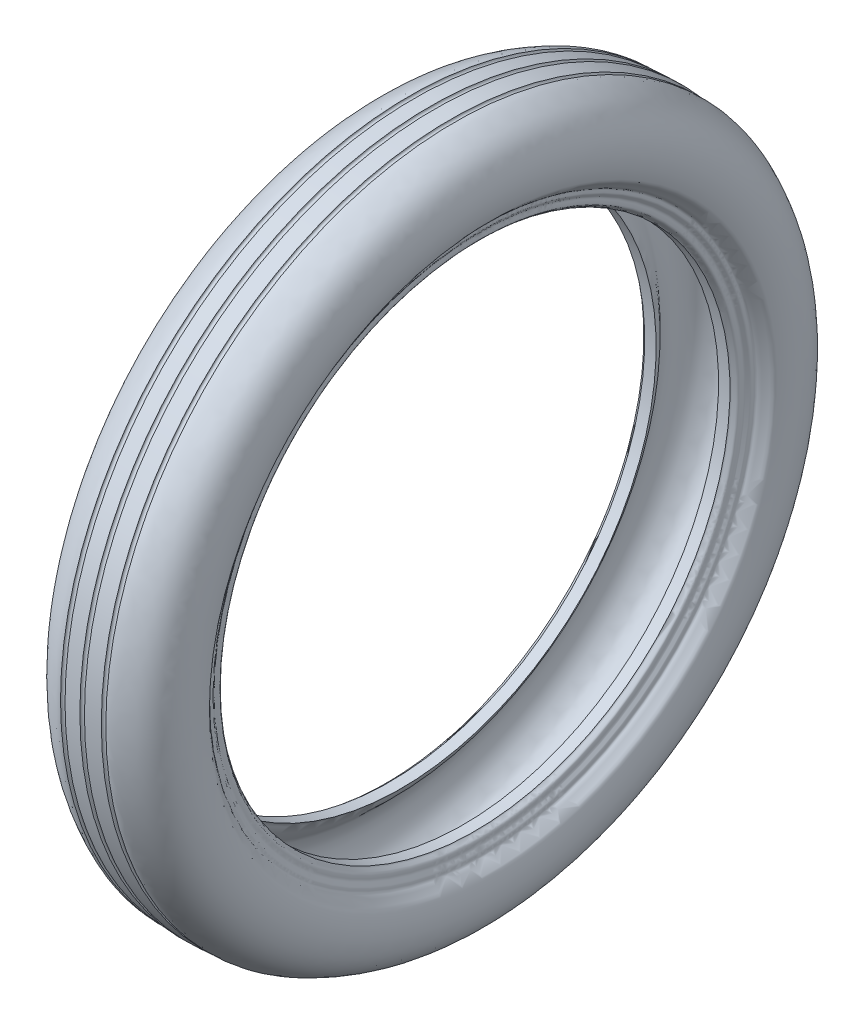
ISO-10303-21;
HEADER;
FILE_DESCRIPTION(('STEP AP214'),'2;1');
FILE_NAME('part.step','',(''),(''),'','','');
FILE_SCHEMA(('AUTOMOTIVE_DESIGN { 1 0 10303 214 1 1 1 1 }'));
ENDSEC;
DATA;
#1=APPLICATION_CONTEXT('core data for automotive mechanical design processes');
#2=APPLICATION_PROTOCOL_DEFINITION('international standard','automotive_design',2000,#1);
#3=PRODUCT_CONTEXT('',#1,'mechanical');
#4=PRODUCT('Part','Part','',(#3));
#5=PRODUCT_RELATED_PRODUCT_CATEGORY('part','',(#4));
#6=PRODUCT_DEFINITION_FORMATION('','',#4);
#7=PRODUCT_DEFINITION_CONTEXT('part definition',#1,'design');
#8=PRODUCT_DEFINITION('design','',#6,#7);
#9=PRODUCT_DEFINITION_SHAPE('','',#8);
#10=(LENGTH_UNIT() NAMED_UNIT(*) SI_UNIT(.MILLI.,.METRE.));
#11=(NAMED_UNIT(*) PLANE_ANGLE_UNIT() SI_UNIT($,.RADIAN.));
#12=(NAMED_UNIT(*) SI_UNIT($,.STERADIAN.) SOLID_ANGLE_UNIT());
#13=UNCERTAINTY_MEASURE_WITH_UNIT(LENGTH_MEASURE(1.E-05),#10,'distance_accuracy_value','');
#14=(GEOMETRIC_REPRESENTATION_CONTEXT(3) GLOBAL_UNCERTAINTY_ASSIGNED_CONTEXT((#13)) GLOBAL_UNIT_ASSIGNED_CONTEXT((#10,
#11,#12)) REPRESENTATION_CONTEXT('',''));
#15=CARTESIAN_POINT('',(0.,0.,0.));
#16=DIRECTION('',(0.,0.,1.));
#17=DIRECTION('',(1.,0.,0.));
#18=AXIS2_PLACEMENT_3D('',#15,#16,#17);
#19=CARTESIAN_POINT('',(-24.8172630139917,203.,0.));
#20=CARTESIAN_POINT('',(-27.2283998288289,205.06391431928,0.));
#21=CARTESIAN_POINT('',(-28.5496427344952,210.327625908058,0.));
#22=CARTESIAN_POINT('',(-33.6712545353592,215.019378984169,0.));
#23=CARTESIAN_POINT('',(-37.7772976660351,219.010363555149,0.));
#24=CARTESIAN_POINT('',(-42.2633577257313,223.062020269606,0.));
#25=CARTESIAN_POINT('',(-45.1671204187017,229.55393791157,0.));
#26=CARTESIAN_POINT('',(-48.0286654197166,236.65779205585,0.));
#27=CARTESIAN_POINT('',(-47.8879674715827,244.882513096217,0.));
#28=CARTESIAN_POINT('',(-46.3948773163548,254.057111445877,0.));
#29=CARTESIAN_POINT('',(-40.3486929351291,261.403587543646,0.));
#30=CARTESIAN_POINT('',(-33.851481321555,268.81086706887,0.));
#31=CARTESIAN_POINT('',(-25.2444175261157,271.404992130535,0.));
#32=CARTESIAN_POINT('',(-16.7423312191855,273.18641912113,0.));
#33=CARTESIAN_POINT('',(-10.1405547550226,273.463220362378,0.));
#34=CARTESIAN_POINT('',(-4.54429512443641,274.014061695448,0.));
#35=CARTESIAN_POINT('',(-1.75340207589835,273.445280920895,0.));
#36=CARTESIAN_POINT('',(0.,273.651830628835,0.));
#37=B_SPLINE_CURVE_WITH_KNOTS('',3,(#19,#20,#21,#22,#23,#24,#25,#26,#27,#28,#29,#30,#31,#32,#33,
#34,#35,#36),.UNSPECIFIED.,.F.,.F.,(4,1,1,1,1,1,1,1,1,1,1,1,1,1,1,4),(0.,0.0822330624444425,
0.137617146698626,0.183009302880853,0.237253629031035,0.297469874379483,0.371716047539101,
0.44060468979368,0.515818013596818,0.616103802574388,0.690267434104086,0.776013817716258,
0.849380324821276,0.924772592656254,0.952990480004338,1.),.UNSPECIFIED.);
#38=CARTESIAN_POINT('',(-102.722911074857,0.,0.));
#39=DIRECTION('',(-1.,0.,0.));
#40=AXIS1_PLACEMENT('',#38,#39);
#41=SURFACE_OF_REVOLUTION('',#37,#40);
#42=CARTESIAN_POINT('',(0.,0.,0.));
#43=DIRECTION('',(-1.,0.,0.));
#44=DIRECTION('',(0.,0.,1.));
#45=AXIS2_PLACEMENT_3D('',#42,#43,#44);
#46=CIRCLE('',#45,273.651830628835);
#47=CARTESIAN_POINT('',(0.,0.,273.651830628835));
#48=VERTEX_POINT('',#47);
#49=EDGE_CURVE('E10',#48,#48,#46,.T.);
#50=ORIENTED_EDGE('',*,*,#49,.F.);
#51=EDGE_LOOP('',(#50));
#52=FACE_BOUND('',#51,.T.);
#53=CARTESIAN_POINT('',(-24.8172630139917,0.,0.));
#54=DIRECTION('',(-1.,0.,0.));
#55=DIRECTION('',(0.,0.,1.));
#56=AXIS2_PLACEMENT_3D('',#53,#54,#55);
#57=CIRCLE('',#56,203.);
#58=CARTESIAN_POINT('',(-24.8172630139917,0.,203.));
#59=VERTEX_POINT('',#58);
#60=EDGE_CURVE('E71',#59,#59,#57,.T.);
#61=ORIENTED_EDGE('',*,*,#60,.T.);
#62=EDGE_LOOP('',(#61));
#63=FACE_BOUND('',#62,.T.);
#64=ADVANCED_FACE('F33',(#52,#63),#41,.T.);
#65=CARTESIAN_POINT('',(0.,273.651830628835,0.));
#66=CARTESIAN_POINT('',(1.75340207589832,273.445280920895,0.));
#67=CARTESIAN_POINT('',(4.54429512443637,274.014061695448,0.));
#68=CARTESIAN_POINT('',(10.1405547550225,273.463220362378,0.));
#69=CARTESIAN_POINT('',(16.7423312191854,273.18641912113,0.));
#70=CARTESIAN_POINT('',(25.2444175261157,271.404992130535,0.));
#71=CARTESIAN_POINT('',(33.851481321555,268.81086706887,0.));
#72=CARTESIAN_POINT('',(40.3486929351291,261.403587543646,0.));
#73=CARTESIAN_POINT('',(46.3948773163547,254.057111445877,0.));
#74=CARTESIAN_POINT('',(47.8879674715826,244.882513096217,0.));
#75=CARTESIAN_POINT('',(48.0286654197166,236.65779205585,0.));
#76=CARTESIAN_POINT('',(45.1671204187017,229.55393791157,0.));
#77=CARTESIAN_POINT('',(42.2633577257312,223.062020269606,0.));
#78=CARTESIAN_POINT('',(37.7772976660351,219.010363555149,0.));
#79=CARTESIAN_POINT('',(33.6712545353592,215.019378984169,0.));
#80=CARTESIAN_POINT('',(28.5496427344952,210.327625908058,0.));
#81=CARTESIAN_POINT('',(27.2283998288289,205.06391431928,0.));
#82=CARTESIAN_POINT('',(24.8172630139916,203.,0.));
#83=B_SPLINE_CURVE_WITH_KNOTS('',3,(#65,#66,#67,#68,#69,#70,#71,#72,#73,#74,#75,#76,#77,#78,#79,
#80,#81,#82),.UNSPECIFIED.,.F.,.F.,(4,1,1,1,1,1,1,1,1,1,1,1,1,1,1,4),(0.,0.0470095199956622,
0.0752274073437459,0.150619675178724,0.223986182283742,0.309732565895914,0.383896197425612,
0.484181986403182,0.55939531020632,0.628283952460899,0.702530125620518,0.762746370968965,
0.816990697119147,0.862382853301374,0.917766937555558,1.),.UNSPECIFIED.);
#84=CARTESIAN_POINT('',(-102.722911074857,0.,0.));
#85=DIRECTION('',(-1.,0.,0.));
#86=AXIS1_PLACEMENT('',#84,#85);
#87=SURFACE_OF_REVOLUTION('',#83,#86);
#88=CARTESIAN_POINT('',(24.8172630139917,0.,0.));
#89=DIRECTION('',(-1.,0.,0.));
#90=DIRECTION('',(0.,0.,1.));
#91=AXIS2_PLACEMENT_3D('',#88,#89,#90);
#92=CIRCLE('',#91,203.);
#93=CARTESIAN_POINT('',(24.8172630139917,0.,203.));
#94=VERTEX_POINT('',#93);
#95=EDGE_CURVE('E40',#94,#94,#92,.T.);
#96=ORIENTED_EDGE('',*,*,#95,.F.);
#97=EDGE_LOOP('',(#96));
#98=FACE_BOUND('',#97,.T.);
#99=ORIENTED_EDGE('',*,*,#49,.T.);
#100=EDGE_LOOP('',(#99));
#101=FACE_BOUND('',#100,.T.);
#102=ADVANCED_FACE('F118',(#98,#101),#87,.T.);
#103=CARTESIAN_POINT('',(-102.722911074857,0.,0.));
#104=DIRECTION('',(-1.,0.,0.));
#105=DIRECTION('',(0.,0.,1.));
#106=AXIS2_PLACEMENT_3D('',#103,#104,#105);
#107=CYLINDRICAL_SURFACE('',#106,203.);
#108=CARTESIAN_POINT('',(33.9052748219322,0.,0.));
#109=DIRECTION('',(-1.,0.,0.));
#110=DIRECTION('',(0.,0.,1.));
#111=AXIS2_PLACEMENT_3D('',#108,#109,#110);
#112=CIRCLE('',#111,203.);
#113=CARTESIAN_POINT('',(33.9052748219322,0.,203.));
#114=VERTEX_POINT('',#113);
#115=EDGE_CURVE('E44',#114,#114,#112,.T.);
#116=ORIENTED_EDGE('',*,*,#115,.F.);
#117=EDGE_LOOP('',(#116));
#118=FACE_BOUND('',#117,.T.);
#119=ORIENTED_EDGE('',*,*,#95,.T.);
#120=EDGE_LOOP('',(#119));
#121=FACE_BOUND('',#120,.T.);
#122=ADVANCED_FACE('F115',(#118,#121),#107,.F.);
#123=CARTESIAN_POINT('',(33.9052748219323,203.,0.));
#124=CARTESIAN_POINT('',(34.4514477122976,204.223315441255,0.));
#125=CARTESIAN_POINT('',(38.405176851135,205.210772848352,0.));
#126=CARTESIAN_POINT('',(37.5895196663085,208.702454770499,0.));
#127=CARTESIAN_POINT('',(37.3176730115443,211.637363166268,0.));
#128=CARTESIAN_POINT('',(40.3679293440638,213.465220786409,0.));
#129=CARTESIAN_POINT('',(39.0660676586276,217.086806756293,0.));
#130=CARTESIAN_POINT('',(42.5299588621192,218.987124675277,0.));
#131=CARTESIAN_POINT('',(44.4812031460707,222.024976144124,0.));
#132=CARTESIAN_POINT('',(48.1613248996428,224.664233070907,0.));
#133=CARTESIAN_POINT('',(49.3373100798012,231.297261903147,0.));
#134=CARTESIAN_POINT('',(50.5659703704679,239.217588361253,0.));
#135=CARTESIAN_POINT('',(49.5419089182548,249.309832870114,0.));
#136=CARTESIAN_POINT('',(46.4257794125868,258.785832909676,0.));
#137=CARTESIAN_POINT('',(40.6849116029119,266.454028141102,0.));
#138=CARTESIAN_POINT('',(33.8688282793654,271.544671240841,0.));
#139=CARTESIAN_POINT('',(26.5848661668035,275.239525498986,0.));
#140=CARTESIAN_POINT('',(21.3849500525043,277.770418692312,0.));
#141=CARTESIAN_POINT('',(18.0012541580362,277.496758701426,0.));
#142=B_SPLINE_CURVE_WITH_KNOTS('',3,(#123,#124,#125,#126,#127,#128,#129,#130,#131,#132,#133,
#134,#135,#136,#137,#138,#139,#140,#141),.UNSPECIFIED.,.F.,.F.,(4,1,1,1,1,1,1,1,1,1,1,1,1,1,1,1,
4),(0.,0.0502849018641816,0.0809639249454713,0.0972057606943899,0.139297033110355,
0.164562110942005,0.195188010133947,0.242420179219544,0.280702553209471,0.328072425704126,
0.440671496514186,0.53314982377352,0.638161135079807,0.746440040072595,0.823682365401741,
0.89958494243369,1.),.UNSPECIFIED.);
#143=CARTESIAN_POINT('',(-102.722911074857,0.,0.));
#144=DIRECTION('',(-1.,0.,0.));
#145=AXIS1_PLACEMENT('',#143,#144);
#146=SURFACE_OF_REVOLUTION('',#142,#145);
#147=CARTESIAN_POINT('',(18.0012541580362,0.,0.));
#148=DIRECTION('',(-1.,0.,0.));
#149=DIRECTION('',(0.,0.,1.));
#150=AXIS2_PLACEMENT_3D('',#147,#148,#149);
#151=CIRCLE('',#150,277.496758701426);
#152=CARTESIAN_POINT('',(18.0012541580362,0.,277.496758701426));
#153=VERTEX_POINT('',#152);
#154=EDGE_CURVE('E48',#153,#153,#151,.T.);
#155=ORIENTED_EDGE('',*,*,#154,.F.);
#156=EDGE_LOOP('',(#155));
#157=FACE_BOUND('',#156,.T.);
#158=ORIENTED_EDGE('',*,*,#115,.T.);
#159=EDGE_LOOP('',(#158));
#160=FACE_BOUND('',#159,.T.);
#161=ADVANCED_FACE('F111',(#157,#160),#146,.T.);
#162=CARTESIAN_POINT('',(16.2157456896604,0.,0.));
#163=DIRECTION('',(-1.,0.,0.));
#164=DIRECTION('',(0.,0.,1.));
#165=AXIS2_PLACEMENT_3D('',#162,#163,#164);
#166=TOROIDAL_SURFACE('',#165,277.496758701426,1.7855084683758);
#167=CARTESIAN_POINT('',(14.4302372212846,0.,0.));
#168=DIRECTION('',(-1.,0.,0.));
#169=DIRECTION('',(0.,0.,1.));
#170=AXIS2_PLACEMENT_3D('',#167,#168,#169);
#171=CIRCLE('',#170,277.496758701426);
#172=CARTESIAN_POINT('',(14.4302372212846,0.,277.496758701426));
#173=VERTEX_POINT('',#172);
#174=EDGE_CURVE('E53',#173,#173,#171,.T.);
#175=ORIENTED_EDGE('',*,*,#174,.F.);
#176=EDGE_LOOP('',(#175));
#177=FACE_BOUND('',#176,.T.);
#178=ORIENTED_EDGE('',*,*,#154,.T.);
#179=EDGE_LOOP('',(#178));
#180=FACE_BOUND('',#179,.T.);
#181=ADVANCED_FACE('F107',(#177,#180),#166,.F.);
#182=CARTESIAN_POINT('',(14.4302372212846,0.,0.));
#183=DIRECTION('',(-1.,0.,0.));
#184=DIRECTION('',(0.,0.,1.));
#185=AXIS2_PLACEMENT_3D('',#182,#183,#184);
#186=CONICAL_SURFACE('',#185,277.496758701426,0.0638636091062138);
#187=CARTESIAN_POINT('',(1.81905865515339,0.,0.));
#188=DIRECTION('',(-1.,0.,0.));
#189=DIRECTION('',(0.,0.,1.));
#190=AXIS2_PLACEMENT_3D('',#187,#188,#189);
#191=CIRCLE('',#190,278.303250820303);
#192=CARTESIAN_POINT('',(1.81905865515339,0.,278.303250820303));
#193=VERTEX_POINT('',#192);
#194=EDGE_CURVE('E56',#193,#193,#191,.T.);
#195=ORIENTED_EDGE('',*,*,#194,.F.);
#196=EDGE_LOOP('',(#195));
#197=FACE_BOUND('',#196,.T.);
#198=ORIENTED_EDGE('',*,*,#174,.T.);
#199=EDGE_LOOP('',(#198));
#200=FACE_BOUND('',#199,.T.);
#201=ADVANCED_FACE('F103',(#197,#200),#186,.T.);
#202=CARTESIAN_POINT('',(0.,0.,0.));
#203=DIRECTION('',(-1.,0.,0.));
#204=DIRECTION('',(0.,0.,1.));
#205=AXIS2_PLACEMENT_3D('',#202,#203,#204);
#206=TOROIDAL_SURFACE('',#205,278.303250820303,1.8190586551534);
#207=CARTESIAN_POINT('',(-1.81905865515342,0.,0.));
#208=DIRECTION('',(-1.,0.,0.));
#209=DIRECTION('',(0.,0.,1.));
#210=AXIS2_PLACEMENT_3D('',#207,#208,#209);
#211=CIRCLE('',#210,278.303250820303);
#212=CARTESIAN_POINT('',(-1.81905865515342,0.,278.303250820303));
#213=VERTEX_POINT('',#212);
#214=EDGE_CURVE('E59',#213,#213,#211,.T.);
#215=ORIENTED_EDGE('',*,*,#214,.F.);
#216=EDGE_LOOP('',(#215));
#217=FACE_BOUND('',#216,.T.);
#218=ORIENTED_EDGE('',*,*,#194,.T.);
#219=EDGE_LOOP('',(#218));
#220=FACE_BOUND('',#219,.T.);
#221=ADVANCED_FACE('F99',(#217,#220),#206,.F.);
#222=CARTESIAN_POINT('',(-1.81905865515342,0.,0.));
#223=DIRECTION('',(1.,0.,0.));
#224=DIRECTION('',(0.,0.,-1.));
#225=AXIS2_PLACEMENT_3D('',#222,#223,#224);
#226=CONICAL_SURFACE('',#225,278.303250820303,0.0638636091062136);
#227=CARTESIAN_POINT('',(-14.4302372212846,0.,0.));
#228=DIRECTION('',(-1.,0.,0.));
#229=DIRECTION('',(0.,0.,1.));
#230=AXIS2_PLACEMENT_3D('',#227,#228,#229);
#231=CIRCLE('',#230,277.496758701426);
#232=CARTESIAN_POINT('',(-14.4302372212846,0.,277.496758701426));
#233=VERTEX_POINT('',#232);
#234=EDGE_CURVE('E62',#233,#233,#231,.T.);
#235=ORIENTED_EDGE('',*,*,#234,.F.);
#236=EDGE_LOOP('',(#235));
#237=FACE_BOUND('',#236,.T.);
#238=ORIENTED_EDGE('',*,*,#214,.T.);
#239=EDGE_LOOP('',(#238));
#240=FACE_BOUND('',#239,.T.);
#241=ADVANCED_FACE('F95',(#237,#240),#226,.T.);
#242=CARTESIAN_POINT('',(-16.2157456896604,0.,0.));
#243=DIRECTION('',(-1.,0.,0.));
#244=DIRECTION('',(0.,0.,1.));
#245=AXIS2_PLACEMENT_3D('',#242,#243,#244);
#246=TOROIDAL_SURFACE('',#245,277.496758701426,1.78550846837579);
#247=CARTESIAN_POINT('',(-18.0012541580362,0.,0.));
#248=DIRECTION('',(-1.,0.,0.));
#249=DIRECTION('',(0.,0.,1.));
#250=AXIS2_PLACEMENT_3D('',#247,#248,#249);
#251=CIRCLE('',#250,277.496758701426);
#252=CARTESIAN_POINT('',(-18.0012541580362,0.,277.496758701426));
#253=VERTEX_POINT('',#252);
#254=EDGE_CURVE('E65',#253,#253,#251,.T.);
#255=ORIENTED_EDGE('',*,*,#254,.F.);
#256=EDGE_LOOP('',(#255));
#257=FACE_BOUND('',#256,.T.);
#258=ORIENTED_EDGE('',*,*,#234,.T.);
#259=EDGE_LOOP('',(#258));
#260=FACE_BOUND('',#259,.T.);
#261=ADVANCED_FACE('F91',(#257,#260),#246,.F.);
#262=CARTESIAN_POINT('',(-18.0012541580362,277.496758701426,0.));
#263=CARTESIAN_POINT('',(-21.3849500525043,277.770418692312,0.));
#264=CARTESIAN_POINT('',(-26.5848661668036,275.239525498986,0.));
#265=CARTESIAN_POINT('',(-33.8688282793654,271.544671240841,0.));
#266=CARTESIAN_POINT('',(-40.6849116029119,266.454028141102,0.));
#267=CARTESIAN_POINT('',(-46.4257794125869,258.785832909676,0.));
#268=CARTESIAN_POINT('',(-49.5419089182548,249.309832870114,0.));
#269=CARTESIAN_POINT('',(-50.5659703704679,239.217588361253,0.));
#270=CARTESIAN_POINT('',(-49.3373100798012,231.297261903147,0.));
#271=CARTESIAN_POINT('',(-48.1613248996428,224.664233070907,0.));
#272=CARTESIAN_POINT('',(-44.4812031460707,222.024976144124,0.));
#273=CARTESIAN_POINT('',(-42.5299588621192,218.987124675277,0.));
#274=CARTESIAN_POINT('',(-39.0660676586276,217.086806756293,0.));
#275=CARTESIAN_POINT('',(-40.3679293440638,213.465220786409,0.));
#276=CARTESIAN_POINT('',(-37.3176730115443,211.637363166268,0.));
#277=CARTESIAN_POINT('',(-37.5895196663085,208.702454770499,0.));
#278=CARTESIAN_POINT('',(-38.405176851135,205.210772848352,0.));
#279=CARTESIAN_POINT('',(-34.4514477122976,204.223315441255,0.));
#280=CARTESIAN_POINT('',(-33.9052748219323,203.,0.));
#281=B_SPLINE_CURVE_WITH_KNOTS('',3,(#262,#263,#264,#265,#266,#267,#268,#269,#270,#271,#272,
#273,#274,#275,#276,#277,#278,#279,#280),.UNSPECIFIED.,.F.,.F.,(4,1,1,1,1,1,1,1,1,1,1,1,1,1,1,1,
4),(0.,0.10041505756631,0.176317634598259,0.253559959927405,0.361838864920193,0.46685017622648,
0.559328503485814,0.671927574295874,0.719297446790528,0.757579820780456,0.804811989866053,
0.835437889057995,0.860702966889645,0.90279423930561,0.919036075054529,0.949715098135818,1.),.UNSPECIFIED.);
#282=CARTESIAN_POINT('',(-102.722911074857,0.,0.));
#283=DIRECTION('',(-1.,0.,0.));
#284=AXIS1_PLACEMENT('',#282,#283);
#285=SURFACE_OF_REVOLUTION('',#281,#284);
#286=CARTESIAN_POINT('',(-33.9052748219323,0.,0.));
#287=DIRECTION('',(-1.,0.,0.));
#288=DIRECTION('',(0.,0.,1.));
#289=AXIS2_PLACEMENT_3D('',#286,#287,#288);
#290=CIRCLE('',#289,203.);
#291=CARTESIAN_POINT('',(-33.9052748219323,0.,203.));
#292=VERTEX_POINT('',#291);
#293=EDGE_CURVE('E68',#292,#292,#290,.T.);
#294=ORIENTED_EDGE('',*,*,#293,.F.);
#295=EDGE_LOOP('',(#294));
#296=FACE_BOUND('',#295,.T.);
#297=ORIENTED_EDGE('',*,*,#254,.T.);
#298=EDGE_LOOP('',(#297));
#299=FACE_BOUND('',#298,.T.);
#300=ADVANCED_FACE('F86',(#296,#299),#285,.T.);
#301=CARTESIAN_POINT('',(-102.722911074857,0.,0.));
#302=DIRECTION('',(-1.,0.,0.));
#303=DIRECTION('',(0.,0.,1.));
#304=AXIS2_PLACEMENT_3D('',#301,#302,#303);
#305=CYLINDRICAL_SURFACE('',#304,203.);
#306=ORIENTED_EDGE('',*,*,#60,.F.);
#307=EDGE_LOOP('',(#306));
#308=FACE_BOUND('',#307,.T.);
#309=ORIENTED_EDGE('',*,*,#293,.T.);
#310=EDGE_LOOP('',(#309));
#311=FACE_BOUND('',#310,.T.);
#312=ADVANCED_FACE('F90',(#308,#311),#305,.F.);
#313=CLOSED_SHELL('',(#64,#102,#122,#161,#181,#201,#221,#241,#261,#300,#312));
#314=MANIFOLD_SOLID_BREP('B2',#313);
#315=ADVANCED_BREP_SHAPE_REPRESENTATION('',(#18,#314),#14);
#316=SHAPE_DEFINITION_REPRESENTATION(#9,#315);
ENDSEC;
END-ISO-10303-21;
